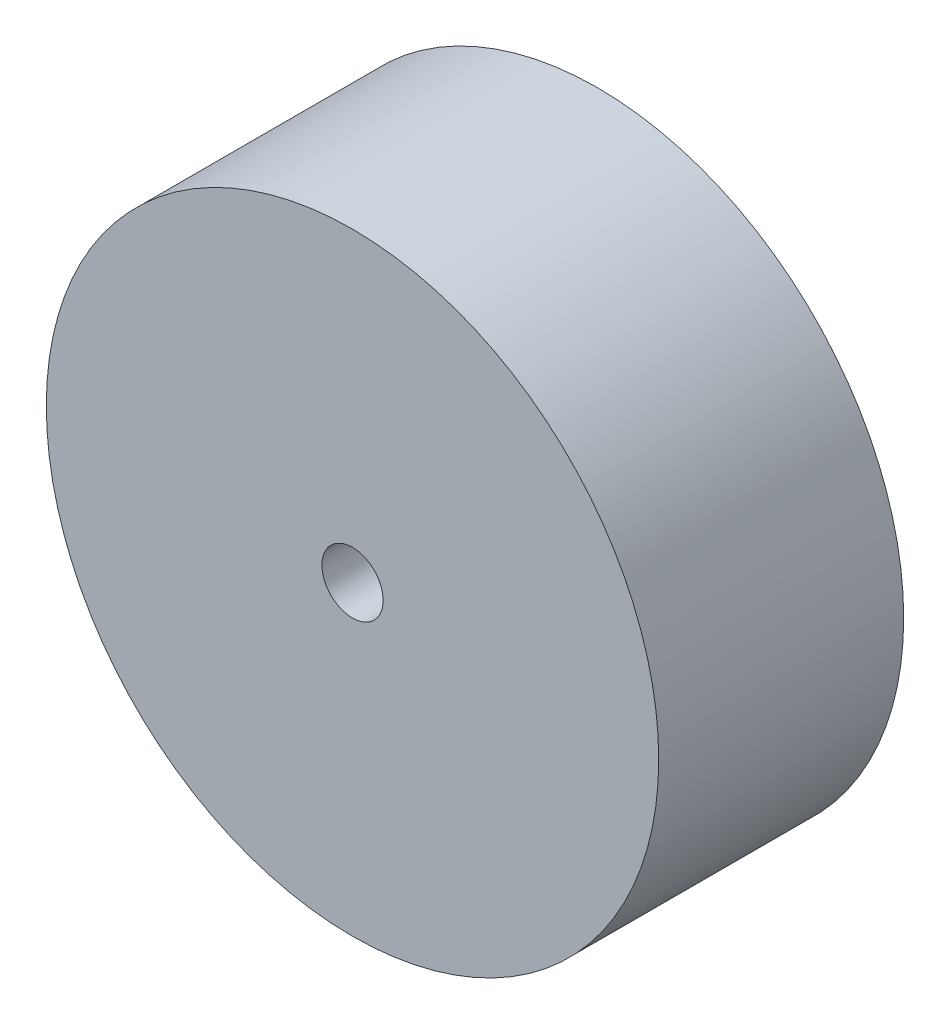
ISO-10303-21;
HEADER;
FILE_DESCRIPTION(('STEP AP214'),'2;1');
FILE_NAME('part.step','',(''),(''),'','','');
FILE_SCHEMA(('AUTOMOTIVE_DESIGN { 1 0 10303 214 1 1 1 1 }'));
ENDSEC;
DATA;
#1=APPLICATION_CONTEXT('core data for automotive mechanical design processes');
#2=APPLICATION_PROTOCOL_DEFINITION('international standard','automotive_design',2000,#1);
#3=PRODUCT_CONTEXT('',#1,'mechanical');
#4=PRODUCT('Part','Part','',(#3));
#5=PRODUCT_RELATED_PRODUCT_CATEGORY('part','',(#4));
#6=PRODUCT_DEFINITION_FORMATION('','',#4);
#7=PRODUCT_DEFINITION_CONTEXT('part definition',#1,'design');
#8=PRODUCT_DEFINITION('design','',#6,#7);
#9=PRODUCT_DEFINITION_SHAPE('','',#8);
#10=(LENGTH_UNIT() NAMED_UNIT(*) SI_UNIT(.MILLI.,.METRE.));
#11=(NAMED_UNIT(*) PLANE_ANGLE_UNIT() SI_UNIT($,.RADIAN.));
#12=(NAMED_UNIT(*) SI_UNIT($,.STERADIAN.) SOLID_ANGLE_UNIT());
#13=UNCERTAINTY_MEASURE_WITH_UNIT(LENGTH_MEASURE(1.E-05),#10,'distance_accuracy_value','');
#14=(GEOMETRIC_REPRESENTATION_CONTEXT(3) GLOBAL_UNCERTAINTY_ASSIGNED_CONTEXT((#13)) GLOBAL_UNIT_ASSIGNED_CONTEXT((#10,
#11,#12)) REPRESENTATION_CONTEXT('',''));
#15=CARTESIAN_POINT('',(0.,0.,0.));
#16=DIRECTION('',(0.,0.,1.));
#17=DIRECTION('',(1.,0.,0.));
#18=AXIS2_PLACEMENT_3D('',#15,#16,#17);
#19=CARTESIAN_POINT('',(0.,0.,20.));
#20=DIRECTION('',(0.,0.,1.));
#21=DIRECTION('',(1.,0.,0.));
#22=AXIS2_PLACEMENT_3D('',#19,#20,#21);
#23=PLANE('',#22);
#24=CARTESIAN_POINT('',(0.,0.,20.));
#25=DIRECTION('',(0.,0.,1.));
#26=DIRECTION('',(1.,0.,0.));
#27=AXIS2_PLACEMENT_3D('',#24,#25,#26);
#28=CIRCLE('',#27,25.);
#29=CARTESIAN_POINT('',(25.,0.,20.));
#30=VERTEX_POINT('',#29);
#31=EDGE_CURVE('E10',#30,#30,#28,.T.);
#32=ORIENTED_EDGE('',*,*,#31,.T.);
#33=EDGE_LOOP('',(#32));
#34=FACE_BOUND('',#33,.T.);
#35=CARTESIAN_POINT('',(0.,0.,20.));
#36=DIRECTION('',(0.,0.,1.));
#37=DIRECTION('',(1.,0.,0.));
#38=AXIS2_PLACEMENT_3D('',#35,#36,#37);
#39=CIRCLE('',#38,2.5);
#40=CARTESIAN_POINT('',(2.5,0.,20.));
#41=VERTEX_POINT('',#40);
#42=EDGE_CURVE('E40',#41,#41,#39,.T.);
#43=ORIENTED_EDGE('',*,*,#42,.F.);
#44=EDGE_LOOP('',(#43));
#45=FACE_BOUND('',#44,.T.);
#46=ADVANCED_FACE('F29',(#34,#45),#23,.T.);
#47=CARTESIAN_POINT('',(0.,0.,0.));
#48=DIRECTION('',(0.,0.,1.));
#49=DIRECTION('',(1.,0.,0.));
#50=AXIS2_PLACEMENT_3D('',#47,#48,#49);
#51=PLANE('',#50);
#52=CARTESIAN_POINT('',(0.,0.,0.));
#53=DIRECTION('',(0.,0.,1.));
#54=DIRECTION('',(1.,0.,0.));
#55=AXIS2_PLACEMENT_3D('',#52,#53,#54);
#56=CIRCLE('',#55,25.);
#57=CARTESIAN_POINT('',(25.,0.,0.));
#58=VERTEX_POINT('',#57);
#59=EDGE_CURVE('E33',#58,#58,#56,.T.);
#60=ORIENTED_EDGE('',*,*,#59,.F.);
#61=EDGE_LOOP('',(#60));
#62=FACE_BOUND('',#61,.T.);
#63=CARTESIAN_POINT('',(0.,0.,0.));
#64=DIRECTION('',(0.,0.,1.));
#65=DIRECTION('',(1.,0.,0.));
#66=AXIS2_PLACEMENT_3D('',#63,#64,#65);
#67=CIRCLE('',#66,2.5);
#68=CARTESIAN_POINT('',(2.5,0.,0.));
#69=VERTEX_POINT('',#68);
#70=EDGE_CURVE('E42',#69,#69,#67,.T.);
#71=ORIENTED_EDGE('',*,*,#70,.T.);
#72=EDGE_LOOP('',(#71));
#73=FACE_BOUND('',#72,.T.);
#74=ADVANCED_FACE('F52',(#62,#73),#51,.F.);
#75=CARTESIAN_POINT('',(0.,0.,20.));
#76=DIRECTION('',(0.,0.,-1.));
#77=DIRECTION('',(-1.,0.,0.));
#78=AXIS2_PLACEMENT_3D('',#75,#76,#77);
#79=CYLINDRICAL_SURFACE('',#78,25.);
#80=ORIENTED_EDGE('',*,*,#31,.F.);
#81=EDGE_LOOP('',(#80));
#82=FACE_BOUND('',#81,.T.);
#83=ORIENTED_EDGE('',*,*,#59,.T.);
#84=EDGE_LOOP('',(#83));
#85=FACE_BOUND('',#84,.T.);
#86=ADVANCED_FACE('F31',(#82,#85),#79,.T.);
#87=CARTESIAN_POINT('',(0.,0.,20.));
#88=DIRECTION('',(0.,0.,-1.));
#89=DIRECTION('',(-1.,0.,0.));
#90=AXIS2_PLACEMENT_3D('',#87,#88,#89);
#91=CYLINDRICAL_SURFACE('',#90,2.5);
#92=ORIENTED_EDGE('',*,*,#42,.T.);
#93=EDGE_LOOP('',(#92));
#94=FACE_BOUND('',#93,.T.);
#95=ORIENTED_EDGE('',*,*,#70,.F.);
#96=EDGE_LOOP('',(#95));
#97=FACE_BOUND('',#96,.T.);
#98=ADVANCED_FACE('F48',(#94,#97),#91,.F.);
#99=CLOSED_SHELL('',(#46,#74,#86,#98));
#100=MANIFOLD_SOLID_BREP('B2',#99);
#101=ADVANCED_BREP_SHAPE_REPRESENTATION('',(#18,#100),#14);
#102=SHAPE_DEFINITION_REPRESENTATION(#9,#101);
ENDSEC;
END-ISO-10303-21;
